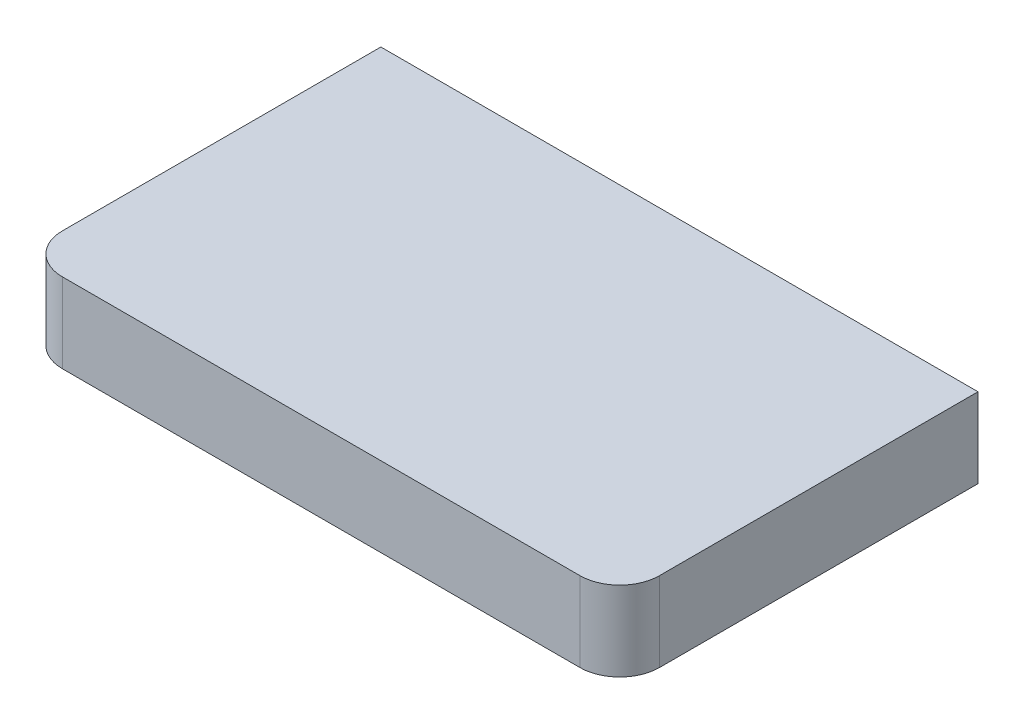
ISO-10303-21;
HEADER;
FILE_DESCRIPTION(('STEP AP214'),'2;1');
FILE_NAME('part.step','',(''),(''),'','','');
FILE_SCHEMA(('AUTOMOTIVE_DESIGN { 1 0 10303 214 1 1 1 1 }'));
ENDSEC;
DATA;
#1=APPLICATION_CONTEXT('core data for automotive mechanical design processes');
#2=APPLICATION_PROTOCOL_DEFINITION('international standard','automotive_design',2000,#1);
#3=PRODUCT_CONTEXT('',#1,'mechanical');
#4=PRODUCT('Part','Part','',(#3));
#5=PRODUCT_RELATED_PRODUCT_CATEGORY('part','',(#4));
#6=PRODUCT_DEFINITION_FORMATION('','',#4);
#7=PRODUCT_DEFINITION_CONTEXT('part definition',#1,'design');
#8=PRODUCT_DEFINITION('design','',#6,#7);
#9=PRODUCT_DEFINITION_SHAPE('','',#8);
#10=(LENGTH_UNIT() NAMED_UNIT(*) SI_UNIT(.MILLI.,.METRE.));
#11=(NAMED_UNIT(*) PLANE_ANGLE_UNIT() SI_UNIT($,.RADIAN.));
#12=(NAMED_UNIT(*) SI_UNIT($,.STERADIAN.) SOLID_ANGLE_UNIT());
#13=UNCERTAINTY_MEASURE_WITH_UNIT(LENGTH_MEASURE(1.E-05),#10,'distance_accuracy_value','');
#14=(GEOMETRIC_REPRESENTATION_CONTEXT(3) GLOBAL_UNCERTAINTY_ASSIGNED_CONTEXT((#13)) GLOBAL_UNIT_ASSIGNED_CONTEXT((#10,
#11,#12)) REPRESENTATION_CONTEXT('',''));
#15=CARTESIAN_POINT('',(0.,0.,0.));
#16=DIRECTION('',(0.,0.,1.));
#17=DIRECTION('',(1.,0.,0.));
#18=AXIS2_PLACEMENT_3D('',#15,#16,#17);
#19=CARTESIAN_POINT('',(-150.,20.,0.));
#20=DIRECTION('',(0.,0.,-1.));
#21=DIRECTION('',(-1.,0.,0.));
#22=AXIS2_PLACEMENT_3D('',#19,#20,#21);
#23=PLANE('',#22);
#24=CARTESIAN_POINT('',(-15.,9.99999999999999,0.));
#25=DIRECTION('',(0.,0.,-1.));
#26=DIRECTION('',(-1.,0.,0.));
#27=AXIS2_PLACEMENT_3D('',#24,#25,#26);
#28=CIRCLE('',#27,5.);
#29=CARTESIAN_POINT('',(-10.,9.99999999999999,0.));
#30=VERTEX_POINT('',#29);
#31=EDGE_CURVE('E143',#30,#30,#28,.F.);
#32=ORIENTED_EDGE('',*,*,#31,.T.);
#33=EDGE_LOOP('',(#32));
#34=FACE_BOUND('',#33,.T.);
#35=CARTESIAN_POINT('',(-75.,9.99999999999999,0.));
#36=DIRECTION('',(0.,0.,-1.));
#37=DIRECTION('',(-1.,0.,0.));
#38=AXIS2_PLACEMENT_3D('',#35,#36,#37);
#39=CIRCLE('',#38,5.);
#40=CARTESIAN_POINT('',(-70.,9.99999999999999,0.));
#41=VERTEX_POINT('',#40);
#42=EDGE_CURVE('E139',#41,#41,#39,.F.);
#43=ORIENTED_EDGE('',*,*,#42,.T.);
#44=EDGE_LOOP('',(#43));
#45=FACE_BOUND('',#44,.T.);
#46=CARTESIAN_POINT('',(-135.,9.99999999999999,0.));
#47=DIRECTION('',(0.,0.,-1.));
#48=DIRECTION('',(-1.,0.,0.));
#49=AXIS2_PLACEMENT_3D('',#46,#47,#48);
#50=CIRCLE('',#49,4.99999999999999);
#51=CARTESIAN_POINT('',(-130.,9.99999999999999,0.));
#52=VERTEX_POINT('',#51);
#53=EDGE_CURVE('E136',#52,#52,#50,.F.);
#54=ORIENTED_EDGE('',*,*,#53,.T.);
#55=EDGE_LOOP('',(#54));
#56=FACE_BOUND('',#55,.T.);
#57=DIRECTION('',(0.,1.,0.));
#58=VECTOR('',#57,1.);
#59=CARTESIAN_POINT('',(0.,20.,0.));
#60=LINE('',#59,#58);
#61=CARTESIAN_POINT('',(0.,0.,0.));
#62=VERTEX_POINT('',#61);
#63=CARTESIAN_POINT('',(0.,20.,0.));
#64=VERTEX_POINT('',#63);
#65=EDGE_CURVE('E120',#62,#64,#60,.T.);
#66=ORIENTED_EDGE('',*,*,#65,.F.);
#67=DIRECTION('',(1.,0.,0.));
#68=VECTOR('',#67,1.);
#69=CARTESIAN_POINT('',(-150.,0.,0.));
#70=LINE('',#69,#68);
#71=CARTESIAN_POINT('',(-150.,0.,0.));
#72=VERTEX_POINT('',#71);
#73=EDGE_CURVE('E111',#72,#62,#70,.T.);
#74=ORIENTED_EDGE('',*,*,#73,.F.);
#75=DIRECTION('',(0.,1.,0.));
#76=VECTOR('',#75,1.);
#77=CARTESIAN_POINT('',(-150.,20.,0.));
#78=LINE('',#77,#76);
#79=CARTESIAN_POINT('',(-150.,20.,0.));
#80=VERTEX_POINT('',#79);
#81=EDGE_CURVE('E107',#72,#80,#78,.T.);
#82=ORIENTED_EDGE('',*,*,#81,.T.);
#83=DIRECTION('',(1.,0.,0.));
#84=VECTOR('',#83,1.);
#85=CARTESIAN_POINT('',(-150.,20.,0.));
#86=LINE('',#85,#84);
#87=EDGE_CURVE('E93',#80,#64,#86,.T.);
#88=ORIENTED_EDGE('',*,*,#87,.T.);
#89=EDGE_LOOP('',(#66,#74,#82,#88));
#90=FACE_BOUND('',#89,.T.);
#91=ADVANCED_FACE('F39',(#34,#45,#56,#90),#23,.T.);
#92=CARTESIAN_POINT('',(-150.,0.,0.));
#93=DIRECTION('',(0.,-1.,0.));
#94=DIRECTION('',(0.,0.,-1.));
#95=AXIS2_PLACEMENT_3D('',#92,#93,#94);
#96=PLANE('',#95);
#97=CARTESIAN_POINT('',(-50.,0.,62.75));
#98=DIRECTION('',(0.,-1.,0.));
#99=DIRECTION('',(0.,0.,-1.));
#100=AXIS2_PLACEMENT_3D('',#97,#98,#99);
#101=CIRCLE('',#100,15.);
#102=CARTESIAN_POINT('',(-50.,0.,77.75));
#103=VERTEX_POINT('',#102);
#104=EDGE_CURVE('E122',#103,#103,#101,.F.);
#105=ORIENTED_EDGE('',*,*,#104,.T.);
#106=EDGE_LOOP('',(#105));
#107=FACE_BOUND('',#106,.T.);
#108=CARTESIAN_POINT('',(-100.,0.,62.75));
#109=DIRECTION('',(0.,-1.,0.));
#110=DIRECTION('',(0.,0.,-1.));
#111=AXIS2_PLACEMENT_3D('',#108,#109,#110);
#112=CIRCLE('',#111,15.);
#113=CARTESIAN_POINT('',(-100.,0.,77.75));
#114=VERTEX_POINT('',#113);
#115=EDGE_CURVE('E130',#114,#114,#112,.F.);
#116=ORIENTED_EDGE('',*,*,#115,.T.);
#117=EDGE_LOOP('',(#116));
#118=FACE_BOUND('',#117,.T.);
#119=DIRECTION('',(1.,0.,0.));
#120=VECTOR('',#119,1.);
#121=CARTESIAN_POINT('',(-150.,0.,90.));
#122=LINE('',#121,#120);
#123=CARTESIAN_POINT('',(-140.,0.,90.));
#124=VERTEX_POINT('',#123);
#125=CARTESIAN_POINT('',(-10.,0.,90.));
#126=VERTEX_POINT('',#125);
#127=EDGE_CURVE('E126',#124,#126,#122,.T.);
#128=ORIENTED_EDGE('',*,*,#127,.F.);
#129=CARTESIAN_POINT('',(-140.,0.,80.));
#130=DIRECTION('',(0.,-1.,0.));
#131=DIRECTION('',(0.,0.,-1.));
#132=AXIS2_PLACEMENT_3D('',#129,#130,#131);
#133=CIRCLE('',#132,10.);
#134=CARTESIAN_POINT('',(-150.,0.,80.));
#135=VERTEX_POINT('',#134);
#136=EDGE_CURVE('E152',#124,#135,#133,.T.);
#137=ORIENTED_EDGE('',*,*,#136,.T.);
#138=DIRECTION('',(0.,0.,-1.));
#139=VECTOR('',#138,1.);
#140=CARTESIAN_POINT('',(-150.,0.,0.));
#141=LINE('',#140,#139);
#142=EDGE_CURVE('E103',#135,#72,#141,.T.);
#143=ORIENTED_EDGE('',*,*,#142,.T.);
#144=ORIENTED_EDGE('',*,*,#73,.T.);
#145=DIRECTION('',(0.,0.,-1.));
#146=VECTOR('',#145,1.);
#147=CARTESIAN_POINT('',(0.,0.,0.));
#148=LINE('',#147,#146);
#149=CARTESIAN_POINT('',(0.,0.,80.));
#150=VERTEX_POINT('',#149);
#151=EDGE_CURVE('E112',#150,#62,#148,.T.);
#152=ORIENTED_EDGE('',*,*,#151,.F.);
#153=CARTESIAN_POINT('',(-10.,0.,80.));
#154=DIRECTION('',(0.,-1.,0.));
#155=DIRECTION('',(0.,0.,-1.));
#156=AXIS2_PLACEMENT_3D('',#153,#154,#155);
#157=CIRCLE('',#156,10.);
#158=EDGE_CURVE('E150',#150,#126,#157,.T.);
#159=ORIENTED_EDGE('',*,*,#158,.T.);
#160=EDGE_LOOP('',(#128,#137,#143,#144,#152,#159));
#161=FACE_BOUND('',#160,.T.);
#162=ADVANCED_FACE('F164',(#107,#118,#161),#96,.T.);
#163=CARTESIAN_POINT('',(-150.,0.,90.));
#164=DIRECTION('',(0.,0.,1.));
#165=DIRECTION('',(0.,-1.,0.));
#166=AXIS2_PLACEMENT_3D('',#163,#164,#165);
#167=PLANE('',#166);
#168=DIRECTION('',(1.,0.,0.));
#169=VECTOR('',#168,1.);
#170=CARTESIAN_POINT('',(-150.,20.,90.));
#171=LINE('',#170,#169);
#172=CARTESIAN_POINT('',(-140.,20.,90.));
#173=VERTEX_POINT('',#172);
#174=CARTESIAN_POINT('',(-10.,20.,90.));
#175=VERTEX_POINT('',#174);
#176=EDGE_CURVE('E102',#173,#175,#171,.T.);
#177=ORIENTED_EDGE('',*,*,#176,.F.);
#178=DIRECTION('',(0.,-1.,0.));
#179=VECTOR('',#178,1.);
#180=CARTESIAN_POINT('',(-140.,0.,90.));
#181=LINE('',#180,#179);
#182=EDGE_CURVE('E147',#173,#124,#181,.T.);
#183=ORIENTED_EDGE('',*,*,#182,.T.);
#184=ORIENTED_EDGE('',*,*,#127,.T.);
#185=DIRECTION('',(0.,-1.,0.));
#186=VECTOR('',#185,1.);
#187=CARTESIAN_POINT('',(-10.,20.,90.));
#188=LINE('',#187,#186);
#189=EDGE_CURVE('E125',#126,#175,#188,.F.);
#190=ORIENTED_EDGE('',*,*,#189,.T.);
#191=EDGE_LOOP('',(#177,#183,#184,#190));
#192=FACE_BOUND('',#191,.T.);
#193=ADVANCED_FACE('F159',(#192),#167,.T.);
#194=CARTESIAN_POINT('',(-150.,20.,90.));
#195=DIRECTION('',(0.,1.,0.));
#196=DIRECTION('',(0.,0.,1.));
#197=AXIS2_PLACEMENT_3D('',#194,#195,#196);
#198=PLANE('',#197);
#199=DIRECTION('',(0.,0.,1.));
#200=VECTOR('',#199,1.);
#201=CARTESIAN_POINT('',(-150.,20.,90.));
#202=LINE('',#201,#200);
#203=CARTESIAN_POINT('',(-150.,20.,80.));
#204=VERTEX_POINT('',#203);
#205=EDGE_CURVE('E95',#80,#204,#202,.T.);
#206=ORIENTED_EDGE('',*,*,#205,.T.);
#207=CARTESIAN_POINT('',(-140.,20.,80.));
#208=DIRECTION('',(0.,1.,0.));
#209=DIRECTION('',(0.,0.,1.));
#210=AXIS2_PLACEMENT_3D('',#207,#208,#209);
#211=CIRCLE('',#210,10.);
#212=EDGE_CURVE('E47',#204,#173,#211,.T.);
#213=ORIENTED_EDGE('',*,*,#212,.T.);
#214=ORIENTED_EDGE('',*,*,#176,.T.);
#215=CARTESIAN_POINT('',(-10.,20.,80.));
#216=DIRECTION('',(0.,1.,0.));
#217=DIRECTION('',(0.,0.,1.));
#218=AXIS2_PLACEMENT_3D('',#215,#216,#217);
#219=CIRCLE('',#218,10.);
#220=CARTESIAN_POINT('',(0.,20.,80.));
#221=VERTEX_POINT('',#220);
#222=EDGE_CURVE('E54',#175,#221,#219,.T.);
#223=ORIENTED_EDGE('',*,*,#222,.T.);
#224=DIRECTION('',(0.,0.,1.));
#225=VECTOR('',#224,1.);
#226=CARTESIAN_POINT('',(0.,20.,90.));
#227=LINE('',#226,#225);
#228=EDGE_CURVE('E97',#64,#221,#227,.T.);
#229=ORIENTED_EDGE('',*,*,#228,.F.);
#230=ORIENTED_EDGE('',*,*,#87,.F.);
#231=EDGE_LOOP('',(#206,#213,#214,#223,#229,#230));
#232=FACE_BOUND('',#231,.T.);
#233=ADVANCED_FACE('F94',(#232),#198,.T.);
#234=CARTESIAN_POINT('',(-150.,0.,0.));
#235=DIRECTION('',(-1.,0.,0.));
#236=DIRECTION('',(0.,0.,1.));
#237=AXIS2_PLACEMENT_3D('',#234,#235,#236);
#238=PLANE('',#237);
#239=ORIENTED_EDGE('',*,*,#142,.F.);
#240=DIRECTION('',(0.,-1.,0.));
#241=VECTOR('',#240,1.);
#242=CARTESIAN_POINT('',(-150.,0.,80.));
#243=LINE('',#242,#241);
#244=EDGE_CURVE('E62',#135,#204,#243,.F.);
#245=ORIENTED_EDGE('',*,*,#244,.T.);
#246=ORIENTED_EDGE('',*,*,#205,.F.);
#247=ORIENTED_EDGE('',*,*,#81,.F.);
#248=EDGE_LOOP('',(#239,#245,#246,#247));
#249=FACE_BOUND('',#248,.T.);
#250=ADVANCED_FACE('F106',(#249),#238,.T.);
#251=CARTESIAN_POINT('',(0.,0.,0.));
#252=DIRECTION('',(-1.,0.,0.));
#253=DIRECTION('',(0.,0.,1.));
#254=AXIS2_PLACEMENT_3D('',#251,#252,#253);
#255=PLANE('',#254);
#256=ORIENTED_EDGE('',*,*,#228,.T.);
#257=DIRECTION('',(0.,-1.,0.));
#258=VECTOR('',#257,1.);
#259=CARTESIAN_POINT('',(0.,0.,80.));
#260=LINE('',#259,#258);
#261=EDGE_CURVE('E11',#221,#150,#260,.T.);
#262=ORIENTED_EDGE('',*,*,#261,.T.);
#263=ORIENTED_EDGE('',*,*,#151,.T.);
#264=ORIENTED_EDGE('',*,*,#65,.T.);
#265=EDGE_LOOP('',(#256,#262,#263,#264));
#266=FACE_BOUND('',#265,.T.);
#267=ADVANCED_FACE('F169',(#266),#255,.F.);
#268=CARTESIAN_POINT('',(-100.,-1.20000000108854E-05,62.75));
#269=DIRECTION('',(0.,1.,0.));
#270=DIRECTION('',(0.,0.,1.));
#271=AXIS2_PLACEMENT_3D('',#268,#269,#270);
#272=CYLINDRICAL_SURFACE('',#271,15.);
#273=CARTESIAN_POINT('',(-100.,9.99999999999999,62.75));
#274=DIRECTION('',(0.,-1.,0.));
#275=DIRECTION('',(0.,0.,-1.));
#276=AXIS2_PLACEMENT_3D('',#273,#274,#275);
#277=CIRCLE('',#276,15.);
#278=CARTESIAN_POINT('',(-100.,9.99999999999999,77.75));
#279=VERTEX_POINT('',#278);
#280=EDGE_CURVE('E116',#279,#279,#277,.T.);
#281=CARTESIAN_POINT('',(-100.,0.,77.75));
#282=CARTESIAN_POINT('',(-100.,0.104166666666657,77.75));
#283=CARTESIAN_POINT('',(-100.,0.208333333333323,77.75));
#284=CARTESIAN_POINT('',(-100.,0.416666666666657,77.75));
#285=CARTESIAN_POINT('',(-100.,0.520833333333323,77.75));
#286=CARTESIAN_POINT('',(-100.,0.729166666666657,77.75));
#287=CARTESIAN_POINT('',(-100.,0.833333333333323,77.75));
#288=CARTESIAN_POINT('',(-100.,1.04166666666666,77.75));
#289=CARTESIAN_POINT('',(-100.,1.14583333333332,77.75));
#290=CARTESIAN_POINT('',(-100.,1.35416666666666,77.75));
#291=CARTESIAN_POINT('',(-100.,1.45833333333332,77.75));
#292=CARTESIAN_POINT('',(-100.,1.66666666666666,77.75));
#293=CARTESIAN_POINT('',(-100.,1.77083333333332,77.75));
#294=CARTESIAN_POINT('',(-100.,1.97916666666666,77.75));
#295=CARTESIAN_POINT('',(-100.,2.08333333333332,77.75));
#296=CARTESIAN_POINT('',(-100.,2.29166666666666,77.75));
#297=CARTESIAN_POINT('',(-100.,2.39583333333332,77.75));
#298=CARTESIAN_POINT('',(-100.,2.60416666666666,77.75));
#299=CARTESIAN_POINT('',(-100.,2.70833333333332,77.75));
#300=CARTESIAN_POINT('',(-100.,2.91666666666666,77.75));
#301=CARTESIAN_POINT('',(-100.,3.02083333333332,77.75));
#302=CARTESIAN_POINT('',(-100.,3.22916666666666,77.75));
#303=CARTESIAN_POINT('',(-100.,3.33333333333332,77.75));
#304=CARTESIAN_POINT('',(-100.,3.54166666666666,77.75));
#305=CARTESIAN_POINT('',(-100.,3.64583333333332,77.75));
#306=CARTESIAN_POINT('',(-100.,3.85416666666666,77.75));
#307=CARTESIAN_POINT('',(-100.,3.95833333333332,77.75));
#308=CARTESIAN_POINT('',(-100.,4.16666666666666,77.75));
#309=CARTESIAN_POINT('',(-100.,4.27083333333332,77.75));
#310=CARTESIAN_POINT('',(-100.,4.47916666666666,77.75));
#311=CARTESIAN_POINT('',(-100.,4.58333333333332,77.75));
#312=CARTESIAN_POINT('',(-100.,4.79166666666666,77.75));
#313=CARTESIAN_POINT('',(-100.,4.89583333333332,77.75));
#314=CARTESIAN_POINT('',(-100.,5.10416666666666,77.75));
#315=CARTESIAN_POINT('',(-100.,5.20833333333332,77.75));
#316=CARTESIAN_POINT('',(-100.,5.41666666666666,77.75));
#317=CARTESIAN_POINT('',(-100.,5.52083333333332,77.75));
#318=CARTESIAN_POINT('',(-100.,5.72916666666666,77.75));
#319=CARTESIAN_POINT('',(-100.,5.83333333333332,77.75));
#320=CARTESIAN_POINT('',(-100.,6.04166666666666,77.75));
#321=CARTESIAN_POINT('',(-100.,6.14583333333332,77.75));
#322=CARTESIAN_POINT('',(-100.,6.35416666666665,77.75));
#323=CARTESIAN_POINT('',(-100.,6.45833333333332,77.75));
#324=CARTESIAN_POINT('',(-100.,6.66666666666665,77.75));
#325=CARTESIAN_POINT('',(-100.,6.77083333333332,77.75));
#326=CARTESIAN_POINT('',(-100.,6.97916666666666,77.75));
#327=CARTESIAN_POINT('',(-100.,7.08333333333332,77.75));
#328=CARTESIAN_POINT('',(-100.,7.29166666666665,77.75));
#329=CARTESIAN_POINT('',(-100.,7.39583333333332,77.75));
#330=CARTESIAN_POINT('',(-100.,7.60416666666665,77.75));
#331=CARTESIAN_POINT('',(-100.,7.70833333333332,77.75));
#332=CARTESIAN_POINT('',(-100.,7.91666666666665,77.75));
#333=CARTESIAN_POINT('',(-100.,8.02083333333332,77.75));
#334=CARTESIAN_POINT('',(-100.,8.22916666666666,77.75));
#335=CARTESIAN_POINT('',(-100.,8.33333333333332,77.75));
#336=CARTESIAN_POINT('',(-100.,8.54166666666666,77.75));
#337=CARTESIAN_POINT('',(-100.,8.64583333333332,77.75));
#338=CARTESIAN_POINT('',(-100.,8.85416666666666,77.75));
#339=CARTESIAN_POINT('',(-100.,8.95833333333332,77.75));
#340=CARTESIAN_POINT('',(-100.,9.16666666666666,77.75));
#341=CARTESIAN_POINT('',(-100.,9.27083333333332,77.75));
#342=CARTESIAN_POINT('',(-100.,9.47916666666666,77.75));
#343=CARTESIAN_POINT('',(-100.,9.58333333333332,77.75));
#344=CARTESIAN_POINT('',(-100.,9.79166666666666,77.75));
#345=CARTESIAN_POINT('',(-100.,9.89583333333332,77.75));
#346=CARTESIAN_POINT('',(-100.,9.99999999999999,77.75));
#347=B_SPLINE_CURVE_WITH_KNOTS('',3,(#281,#282,#283,#284,#285,#286,#287,#288,#289,#290,#291,
#292,#293,#294,#295,#296,#297,#298,#299,#300,#301,#302,#303,#304,#305,#306,#307,#308,#309,#310,
#311,#312,#313,#314,#315,#316,#317,#318,#319,#320,#321,#322,#323,#324,#325,#326,#327,#328,#329,
#330,#331,#332,#333,#334,#335,#336,#337,#338,#339,#340,#341,#342,#343,#344,#345,#346),
.UNSPECIFIED.,.F.,.F.,(4,2,2,2,2,2,2,2,2,2,2,2,2,2,2,2,2,2,2,2,2,2,2,2,2,2,2,2,2,2,2,2,4),(0.,
0.3125,0.625,0.9375,1.25,1.5625,1.875,2.1875,2.5,2.8125,3.125,3.4375,3.75,4.0625,4.375,4.6875,
5.,5.3125,5.625,5.9375,6.25,6.5625,6.875,7.1875,7.5,7.8125,8.125,8.4375,8.75,9.0625,9.375,
9.6875,10.),.UNSPECIFIED.);
#348=EDGE_CURVE('BSEAM171',#114,#279,#347,.T.);
#349=ORIENTED_EDGE('',*,*,#115,.F.);
#350=ORIENTED_EDGE('',*,*,#280,.F.);
#351=ORIENTED_EDGE('',*,*,#348,.T.);
#352=ORIENTED_EDGE('',*,*,#348,.F.);
#353=EDGE_LOOP('',(#349,#351,#350,#352));
#354=FACE_BOUND('',#353,.T.);
#355=ADVANCED_FACE('F171',(#354),#272,.F.);
#356=CARTESIAN_POINT('',(-100.,9.99999999999999,62.75));
#357=DIRECTION('',(0.,-1.,0.));
#358=DIRECTION('',(0.,0.,-1.));
#359=AXIS2_PLACEMENT_3D('',#356,#357,#358);
#360=PLANE('',#359);
#361=ORIENTED_EDGE('',*,*,#280,.T.);
#362=EDGE_LOOP('',(#361));
#363=FACE_BOUND('',#362,.T.);
#364=ADVANCED_FACE('F178',(#363),#360,.T.);
#365=CARTESIAN_POINT('',(-50.,-1.20000000108854E-05,62.75));
#366=DIRECTION('',(0.,1.,0.));
#367=DIRECTION('',(0.,0.,1.));
#368=AXIS2_PLACEMENT_3D('',#365,#366,#367);
#369=CYLINDRICAL_SURFACE('',#368,15.);
#370=CARTESIAN_POINT('',(-50.,9.99999999999999,62.75));
#371=DIRECTION('',(0.,-1.,0.));
#372=DIRECTION('',(0.,0.,-1.));
#373=AXIS2_PLACEMENT_3D('',#370,#371,#372);
#374=CIRCLE('',#373,15.);
#375=CARTESIAN_POINT('',(-50.,9.99999999999999,77.75));
#376=VERTEX_POINT('',#375);
#377=EDGE_CURVE('E133',#376,#376,#374,.T.);
#378=CARTESIAN_POINT('',(-50.,0.,77.75));
#379=CARTESIAN_POINT('',(-50.,0.104166666666657,77.75));
#380=CARTESIAN_POINT('',(-50.,0.208333333333323,77.75));
#381=CARTESIAN_POINT('',(-50.,0.416666666666657,77.75));
#382=CARTESIAN_POINT('',(-50.,0.520833333333323,77.75));
#383=CARTESIAN_POINT('',(-50.,0.729166666666657,77.75));
#384=CARTESIAN_POINT('',(-50.,0.833333333333323,77.75));
#385=CARTESIAN_POINT('',(-50.,1.04166666666666,77.75));
#386=CARTESIAN_POINT('',(-50.,1.14583333333332,77.75));
#387=CARTESIAN_POINT('',(-50.,1.35416666666666,77.75));
#388=CARTESIAN_POINT('',(-50.,1.45833333333332,77.75));
#389=CARTESIAN_POINT('',(-50.,1.66666666666666,77.75));
#390=CARTESIAN_POINT('',(-50.,1.77083333333332,77.75));
#391=CARTESIAN_POINT('',(-50.,1.97916666666666,77.75));
#392=CARTESIAN_POINT('',(-50.,2.08333333333332,77.75));
#393=CARTESIAN_POINT('',(-50.,2.29166666666666,77.75));
#394=CARTESIAN_POINT('',(-50.,2.39583333333332,77.75));
#395=CARTESIAN_POINT('',(-50.,2.60416666666666,77.75));
#396=CARTESIAN_POINT('',(-50.,2.70833333333332,77.75));
#397=CARTESIAN_POINT('',(-50.,2.91666666666666,77.75));
#398=CARTESIAN_POINT('',(-50.,3.02083333333332,77.75));
#399=CARTESIAN_POINT('',(-50.,3.22916666666666,77.75));
#400=CARTESIAN_POINT('',(-50.,3.33333333333332,77.75));
#401=CARTESIAN_POINT('',(-50.,3.54166666666666,77.75));
#402=CARTESIAN_POINT('',(-50.,3.64583333333332,77.75));
#403=CARTESIAN_POINT('',(-50.,3.85416666666666,77.75));
#404=CARTESIAN_POINT('',(-50.,3.95833333333332,77.75));
#405=CARTESIAN_POINT('',(-50.,4.16666666666666,77.75));
#406=CARTESIAN_POINT('',(-50.,4.27083333333332,77.75));
#407=CARTESIAN_POINT('',(-50.,4.47916666666666,77.75));
#408=CARTESIAN_POINT('',(-50.,4.58333333333332,77.75));
#409=CARTESIAN_POINT('',(-50.,4.79166666666666,77.75));
#410=CARTESIAN_POINT('',(-50.,4.89583333333332,77.75));
#411=CARTESIAN_POINT('',(-50.,5.10416666666666,77.75));
#412=CARTESIAN_POINT('',(-50.,5.20833333333332,77.75));
#413=CARTESIAN_POINT('',(-50.,5.41666666666666,77.75));
#414=CARTESIAN_POINT('',(-50.,5.52083333333332,77.75));
#415=CARTESIAN_POINT('',(-50.,5.72916666666666,77.75));
#416=CARTESIAN_POINT('',(-50.,5.83333333333332,77.75));
#417=CARTESIAN_POINT('',(-50.,6.04166666666666,77.75));
#418=CARTESIAN_POINT('',(-50.,6.14583333333332,77.75));
#419=CARTESIAN_POINT('',(-50.,6.35416666666665,77.75));
#420=CARTESIAN_POINT('',(-50.,6.45833333333332,77.75));
#421=CARTESIAN_POINT('',(-50.,6.66666666666665,77.75));
#422=CARTESIAN_POINT('',(-50.,6.77083333333332,77.75));
#423=CARTESIAN_POINT('',(-50.,6.97916666666666,77.75));
#424=CARTESIAN_POINT('',(-50.,7.08333333333332,77.75));
#425=CARTESIAN_POINT('',(-50.,7.29166666666665,77.75));
#426=CARTESIAN_POINT('',(-50.,7.39583333333332,77.75));
#427=CARTESIAN_POINT('',(-50.,7.60416666666665,77.75));
#428=CARTESIAN_POINT('',(-50.,7.70833333333332,77.75));
#429=CARTESIAN_POINT('',(-50.,7.91666666666665,77.75));
#430=CARTESIAN_POINT('',(-50.,8.02083333333332,77.75));
#431=CARTESIAN_POINT('',(-50.,8.22916666666666,77.75));
#432=CARTESIAN_POINT('',(-50.,8.33333333333332,77.75));
#433=CARTESIAN_POINT('',(-50.,8.54166666666666,77.75));
#434=CARTESIAN_POINT('',(-50.,8.64583333333332,77.75));
#435=CARTESIAN_POINT('',(-50.,8.85416666666666,77.75));
#436=CARTESIAN_POINT('',(-50.,8.95833333333332,77.75));
#437=CARTESIAN_POINT('',(-50.,9.16666666666666,77.75));
#438=CARTESIAN_POINT('',(-50.,9.27083333333332,77.75));
#439=CARTESIAN_POINT('',(-50.,9.47916666666666,77.75));
#440=CARTESIAN_POINT('',(-50.,9.58333333333332,77.75));
#441=CARTESIAN_POINT('',(-50.,9.79166666666666,77.75));
#442=CARTESIAN_POINT('',(-50.,9.89583333333332,77.75));
#443=CARTESIAN_POINT('',(-50.,9.99999999999999,77.75));
#444=B_SPLINE_CURVE_WITH_KNOTS('',3,(#378,#379,#380,#381,#382,#383,#384,#385,#386,#387,#388,
#389,#390,#391,#392,#393,#394,#395,#396,#397,#398,#399,#400,#401,#402,#403,#404,#405,#406,#407,
#408,#409,#410,#411,#412,#413,#414,#415,#416,#417,#418,#419,#420,#421,#422,#423,#424,#425,#426,
#427,#428,#429,#430,#431,#432,#433,#434,#435,#436,#437,#438,#439,#440,#441,#442,#443),
.UNSPECIFIED.,.F.,.F.,(4,2,2,2,2,2,2,2,2,2,2,2,2,2,2,2,2,2,2,2,2,2,2,2,2,2,2,2,2,2,2,2,4),(0.,
0.3125,0.625,0.9375,1.25,1.5625,1.875,2.1875,2.5,2.8125,3.125,3.4375,3.75,4.0625,4.375,4.6875,
5.,5.3125,5.625,5.9375,6.25,6.5625,6.875,7.1875,7.5,7.8125,8.125,8.4375,8.75,9.0625,9.375,
9.6875,10.),.UNSPECIFIED.);
#445=EDGE_CURVE('BSEAM227',#103,#376,#444,.T.);
#446=ORIENTED_EDGE('',*,*,#104,.F.);
#447=ORIENTED_EDGE('',*,*,#377,.F.);
#448=ORIENTED_EDGE('',*,*,#445,.T.);
#449=ORIENTED_EDGE('',*,*,#445,.F.);
#450=EDGE_LOOP('',(#446,#448,#447,#449));
#451=FACE_BOUND('',#450,.T.);
#452=ADVANCED_FACE('F227',(#451),#369,.F.);
#453=CARTESIAN_POINT('',(-50.,9.99999999999999,62.75));
#454=DIRECTION('',(0.,-1.,0.));
#455=DIRECTION('',(0.,0.,-1.));
#456=AXIS2_PLACEMENT_3D('',#453,#454,#455);
#457=PLANE('',#456);
#458=ORIENTED_EDGE('',*,*,#377,.T.);
#459=EDGE_LOOP('',(#458));
#460=FACE_BOUND('',#459,.T.);
#461=ADVANCED_FACE('F221',(#460),#457,.T.);
#462=CARTESIAN_POINT('',(-135.,9.99999999999999,-1.2E-05));
#463=DIRECTION('',(0.,0.,1.));
#464=DIRECTION('',(1.,0.,0.));
#465=AXIS2_PLACEMENT_3D('',#462,#463,#464);
#466=CYLINDRICAL_SURFACE('',#465,4.99999999999999);
#467=CARTESIAN_POINT('',(-135.,9.99999999999999,70.));
#468=DIRECTION('',(0.,0.,-1.));
#469=DIRECTION('',(-1.,0.,0.));
#470=AXIS2_PLACEMENT_3D('',#467,#468,#469);
#471=CIRCLE('',#470,4.99999999999999);
#472=CARTESIAN_POINT('',(-130.,9.99999999999999,70.));
#473=VERTEX_POINT('',#472);
#474=EDGE_CURVE('E242',#473,#473,#471,.T.);
#475=CARTESIAN_POINT('',(-130.,9.99999999999999,0.));
#476=CARTESIAN_POINT('',(-130.,9.99999999999999,0.729166666666666));
#477=CARTESIAN_POINT('',(-130.,9.99999999999999,1.45833333333333));
#478=CARTESIAN_POINT('',(-130.,9.99999999999999,2.91666666666667));
#479=CARTESIAN_POINT('',(-130.,9.99999999999999,3.64583333333333));
#480=CARTESIAN_POINT('',(-130.,9.99999999999999,5.10416666666667));
#481=CARTESIAN_POINT('',(-130.,9.99999999999999,5.83333333333334));
#482=CARTESIAN_POINT('',(-130.,9.99999999999999,7.29166666666667));
#483=CARTESIAN_POINT('',(-130.,9.99999999999999,8.02083333333334));
#484=CARTESIAN_POINT('',(-130.,9.99999999999999,9.47916666666667));
#485=CARTESIAN_POINT('',(-130.,9.99999999999999,10.2083333333333));
#486=CARTESIAN_POINT('',(-130.,9.99999999999999,11.6666666666667));
#487=CARTESIAN_POINT('',(-130.,9.99999999999999,12.3958333333333));
#488=CARTESIAN_POINT('',(-130.,9.99999999999999,13.8541666666667));
#489=CARTESIAN_POINT('',(-130.,9.99999999999999,14.5833333333333));
#490=CARTESIAN_POINT('',(-130.,9.99999999999999,16.0416666666667));
#491=CARTESIAN_POINT('',(-130.,9.99999999999999,16.7708333333333));
#492=CARTESIAN_POINT('',(-130.,9.99999999999999,18.2291666666667));
#493=CARTESIAN_POINT('',(-130.,9.99999999999999,18.9583333333333));
#494=CARTESIAN_POINT('',(-130.,9.99999999999999,20.4166666666667));
#495=CARTESIAN_POINT('',(-130.,9.99999999999999,21.1458333333333));
#496=CARTESIAN_POINT('',(-130.,9.99999999999999,22.6041666666667));
#497=CARTESIAN_POINT('',(-130.,9.99999999999999,23.3333333333333));
#498=CARTESIAN_POINT('',(-130.,9.99999999999999,24.7916666666667));
#499=CARTESIAN_POINT('',(-130.,9.99999999999999,25.5208333333333));
#500=CARTESIAN_POINT('',(-130.,9.99999999999999,26.9791666666667));
#501=CARTESIAN_POINT('',(-130.,9.99999999999999,27.7083333333333));
#502=CARTESIAN_POINT('',(-130.,9.99999999999999,29.1666666666667));
#503=CARTESIAN_POINT('',(-130.,9.99999999999999,29.8958333333333));
#504=CARTESIAN_POINT('',(-130.,9.99999999999999,31.3541666666667));
#505=CARTESIAN_POINT('',(-130.,9.99999999999999,32.0833333333333));
#506=CARTESIAN_POINT('',(-130.,9.99999999999999,33.5416666666667));
#507=CARTESIAN_POINT('',(-130.,9.99999999999999,34.2708333333333));
#508=CARTESIAN_POINT('',(-130.,9.99999999999999,35.7291666666667));
#509=CARTESIAN_POINT('',(-130.,9.99999999999999,36.4583333333333));
#510=CARTESIAN_POINT('',(-130.,9.99999999999999,37.9166666666667));
#511=CARTESIAN_POINT('',(-130.,9.99999999999999,38.6458333333333));
#512=CARTESIAN_POINT('',(-130.,9.99999999999999,40.1041666666667));
#513=CARTESIAN_POINT('',(-130.,9.99999999999999,40.8333333333333));
#514=CARTESIAN_POINT('',(-130.,9.99999999999999,42.2916666666667));
#515=CARTESIAN_POINT('',(-130.,9.99999999999999,43.0208333333333));
#516=CARTESIAN_POINT('',(-130.,9.99999999999999,44.4791666666667));
#517=CARTESIAN_POINT('',(-130.,9.99999999999999,45.2083333333333));
#518=CARTESIAN_POINT('',(-130.,9.99999999999999,46.6666666666667));
#519=CARTESIAN_POINT('',(-130.,9.99999999999999,47.3958333333333));
#520=CARTESIAN_POINT('',(-130.,9.99999999999999,48.8541666666667));
#521=CARTESIAN_POINT('',(-130.,9.99999999999999,49.5833333333333));
#522=CARTESIAN_POINT('',(-130.,9.99999999999999,51.0416666666667));
#523=CARTESIAN_POINT('',(-130.,9.99999999999999,51.7708333333333));
#524=CARTESIAN_POINT('',(-130.,9.99999999999999,53.2291666666667));
#525=CARTESIAN_POINT('',(-130.,9.99999999999999,53.9583333333333));
#526=CARTESIAN_POINT('',(-130.,9.99999999999999,55.4166666666667));
#527=CARTESIAN_POINT('',(-130.,9.99999999999999,56.1458333333333));
#528=CARTESIAN_POINT('',(-130.,9.99999999999999,57.6041666666667));
#529=CARTESIAN_POINT('',(-130.,9.99999999999999,58.3333333333334));
#530=CARTESIAN_POINT('',(-130.,9.99999999999999,59.7916666666667));
#531=CARTESIAN_POINT('',(-130.,9.99999999999999,60.5208333333334));
#532=CARTESIAN_POINT('',(-130.,9.99999999999999,61.9791666666667));
#533=CARTESIAN_POINT('',(-130.,9.99999999999999,62.7083333333333));
#534=CARTESIAN_POINT('',(-130.,9.99999999999999,64.1666666666667));
#535=CARTESIAN_POINT('',(-130.,9.99999999999999,64.8958333333333));
#536=CARTESIAN_POINT('',(-130.,9.99999999999999,66.3541666666667));
#537=CARTESIAN_POINT('',(-130.,9.99999999999999,67.0833333333334));
#538=CARTESIAN_POINT('',(-130.,9.99999999999999,68.5416666666667));
#539=CARTESIAN_POINT('',(-130.,9.99999999999999,69.2708333333334));
#540=CARTESIAN_POINT('',(-130.,9.99999999999999,70.));
#541=B_SPLINE_CURVE_WITH_KNOTS('',3,(#475,#476,#477,#478,#479,#480,#481,#482,#483,#484,#485,
#486,#487,#488,#489,#490,#491,#492,#493,#494,#495,#496,#497,#498,#499,#500,#501,#502,#503,#504,
#505,#506,#507,#508,#509,#510,#511,#512,#513,#514,#515,#516,#517,#518,#519,#520,#521,#522,#523,
#524,#525,#526,#527,#528,#529,#530,#531,#532,#533,#534,#535,#536,#537,#538,#539,#540),
.UNSPECIFIED.,.F.,.F.,(4,2,2,2,2,2,2,2,2,2,2,2,2,2,2,2,2,2,2,2,2,2,2,2,2,2,2,2,2,2,2,2,4),(0.,
2.1875,4.375,6.5625,8.75,10.9375,13.125,15.3125,17.5,19.6875,21.875,24.0625,26.25,28.4375,
30.625,32.8125,35.,37.1875,39.375,41.5625,43.75,45.9375,48.125,50.3125,52.5,54.6875,56.875,
59.0625,61.25,63.4375,65.625,67.8125,70.),.UNSPECIFIED.);
#542=EDGE_CURVE('BSEAM219',#52,#473,#541,.T.);
#543=ORIENTED_EDGE('',*,*,#53,.F.);
#544=ORIENTED_EDGE('',*,*,#474,.F.);
#545=ORIENTED_EDGE('',*,*,#542,.T.);
#546=ORIENTED_EDGE('',*,*,#542,.F.);
#547=EDGE_LOOP('',(#543,#545,#544,#546));
#548=FACE_BOUND('',#547,.T.);
#549=ADVANCED_FACE('F219',(#548),#466,.F.);
#550=CARTESIAN_POINT('',(-135.,9.99999999999999,70.));
#551=DIRECTION('',(0.,0.,-1.));
#552=DIRECTION('',(-1.,0.,0.));
#553=AXIS2_PLACEMENT_3D('',#550,#551,#552);
#554=PLANE('',#553);
#555=ORIENTED_EDGE('',*,*,#474,.T.);
#556=EDGE_LOOP('',(#555));
#557=FACE_BOUND('',#556,.T.);
#558=ADVANCED_FACE('F214',(#557),#554,.T.);
#559=CARTESIAN_POINT('',(-75.,9.99999999999999,-1.2E-05));
#560=DIRECTION('',(0.,0.,1.));
#561=DIRECTION('',(1.,0.,0.));
#562=AXIS2_PLACEMENT_3D('',#559,#560,#561);
#563=CYLINDRICAL_SURFACE('',#562,5.);
#564=CARTESIAN_POINT('',(-75.,9.99999999999999,70.));
#565=DIRECTION('',(0.,0.,-1.));
#566=DIRECTION('',(-1.,0.,0.));
#567=AXIS2_PLACEMENT_3D('',#564,#565,#566);
#568=CIRCLE('',#567,5.);
#569=CARTESIAN_POINT('',(-70.,9.99999999999999,70.));
#570=VERTEX_POINT('',#569);
#571=EDGE_CURVE('E245',#570,#570,#568,.T.);
#572=CARTESIAN_POINT('',(-70.,9.99999999999999,0.));
#573=CARTESIAN_POINT('',(-70.,9.99999999999999,0.729166666666666));
#574=CARTESIAN_POINT('',(-70.,9.99999999999999,1.45833333333333));
#575=CARTESIAN_POINT('',(-70.,9.99999999999999,2.91666666666667));
#576=CARTESIAN_POINT('',(-70.,9.99999999999999,3.64583333333333));
#577=CARTESIAN_POINT('',(-70.,9.99999999999999,5.10416666666667));
#578=CARTESIAN_POINT('',(-70.,9.99999999999999,5.83333333333334));
#579=CARTESIAN_POINT('',(-70.,9.99999999999999,7.29166666666667));
#580=CARTESIAN_POINT('',(-70.,9.99999999999999,8.02083333333334));
#581=CARTESIAN_POINT('',(-70.,9.99999999999999,9.47916666666667));
#582=CARTESIAN_POINT('',(-70.,9.99999999999999,10.2083333333333));
#583=CARTESIAN_POINT('',(-70.,9.99999999999999,11.6666666666667));
#584=CARTESIAN_POINT('',(-70.,9.99999999999999,12.3958333333333));
#585=CARTESIAN_POINT('',(-70.,9.99999999999999,13.8541666666667));
#586=CARTESIAN_POINT('',(-70.,9.99999999999999,14.5833333333333));
#587=CARTESIAN_POINT('',(-70.,9.99999999999999,16.0416666666667));
#588=CARTESIAN_POINT('',(-70.,9.99999999999999,16.7708333333333));
#589=CARTESIAN_POINT('',(-70.,9.99999999999999,18.2291666666667));
#590=CARTESIAN_POINT('',(-70.,9.99999999999999,18.9583333333333));
#591=CARTESIAN_POINT('',(-70.,9.99999999999999,20.4166666666667));
#592=CARTESIAN_POINT('',(-70.,9.99999999999999,21.1458333333333));
#593=CARTESIAN_POINT('',(-70.,9.99999999999999,22.6041666666667));
#594=CARTESIAN_POINT('',(-70.,9.99999999999999,23.3333333333333));
#595=CARTESIAN_POINT('',(-70.,9.99999999999999,24.7916666666667));
#596=CARTESIAN_POINT('',(-70.,9.99999999999999,25.5208333333333));
#597=CARTESIAN_POINT('',(-70.,9.99999999999999,26.9791666666667));
#598=CARTESIAN_POINT('',(-70.,9.99999999999999,27.7083333333333));
#599=CARTESIAN_POINT('',(-70.,9.99999999999999,29.1666666666667));
#600=CARTESIAN_POINT('',(-70.,9.99999999999999,29.8958333333333));
#601=CARTESIAN_POINT('',(-70.,9.99999999999999,31.3541666666667));
#602=CARTESIAN_POINT('',(-70.,9.99999999999999,32.0833333333333));
#603=CARTESIAN_POINT('',(-70.,9.99999999999999,33.5416666666667));
#604=CARTESIAN_POINT('',(-70.,9.99999999999999,34.2708333333333));
#605=CARTESIAN_POINT('',(-70.,9.99999999999999,35.7291666666667));
#606=CARTESIAN_POINT('',(-70.,9.99999999999999,36.4583333333333));
#607=CARTESIAN_POINT('',(-70.,9.99999999999999,37.9166666666667));
#608=CARTESIAN_POINT('',(-70.,9.99999999999999,38.6458333333333));
#609=CARTESIAN_POINT('',(-70.,9.99999999999999,40.1041666666667));
#610=CARTESIAN_POINT('',(-70.,9.99999999999999,40.8333333333333));
#611=CARTESIAN_POINT('',(-70.,9.99999999999999,42.2916666666667));
#612=CARTESIAN_POINT('',(-70.,9.99999999999999,43.0208333333333));
#613=CARTESIAN_POINT('',(-70.,9.99999999999999,44.4791666666667));
#614=CARTESIAN_POINT('',(-70.,9.99999999999999,45.2083333333333));
#615=CARTESIAN_POINT('',(-70.,9.99999999999999,46.6666666666667));
#616=CARTESIAN_POINT('',(-70.,9.99999999999999,47.3958333333333));
#617=CARTESIAN_POINT('',(-70.,9.99999999999999,48.8541666666667));
#618=CARTESIAN_POINT('',(-70.,9.99999999999999,49.5833333333333));
#619=CARTESIAN_POINT('',(-70.,9.99999999999999,51.0416666666667));
#620=CARTESIAN_POINT('',(-70.,9.99999999999999,51.7708333333333));
#621=CARTESIAN_POINT('',(-70.,9.99999999999999,53.2291666666667));
#622=CARTESIAN_POINT('',(-70.,9.99999999999999,53.9583333333333));
#623=CARTESIAN_POINT('',(-70.,9.99999999999999,55.4166666666667));
#624=CARTESIAN_POINT('',(-70.,9.99999999999999,56.1458333333333));
#625=CARTESIAN_POINT('',(-70.,9.99999999999999,57.6041666666667));
#626=CARTESIAN_POINT('',(-70.,9.99999999999999,58.3333333333334));
#627=CARTESIAN_POINT('',(-70.,9.99999999999999,59.7916666666667));
#628=CARTESIAN_POINT('',(-70.,9.99999999999999,60.5208333333334));
#629=CARTESIAN_POINT('',(-70.,9.99999999999999,61.9791666666667));
#630=CARTESIAN_POINT('',(-70.,9.99999999999999,62.7083333333333));
#631=CARTESIAN_POINT('',(-70.,9.99999999999999,64.1666666666667));
#632=CARTESIAN_POINT('',(-70.,9.99999999999999,64.8958333333333));
#633=CARTESIAN_POINT('',(-70.,9.99999999999999,66.3541666666667));
#634=CARTESIAN_POINT('',(-70.,9.99999999999999,67.0833333333334));
#635=CARTESIAN_POINT('',(-70.,9.99999999999999,68.5416666666667));
#636=CARTESIAN_POINT('',(-70.,9.99999999999999,69.2708333333334));
#637=CARTESIAN_POINT('',(-70.,9.99999999999999,70.));
#638=B_SPLINE_CURVE_WITH_KNOTS('',3,(#572,#573,#574,#575,#576,#577,#578,#579,#580,#581,#582,
#583,#584,#585,#586,#587,#588,#589,#590,#591,#592,#593,#594,#595,#596,#597,#598,#599,#600,#601,
#602,#603,#604,#605,#606,#607,#608,#609,#610,#611,#612,#613,#614,#615,#616,#617,#618,#619,#620,
#621,#622,#623,#624,#625,#626,#627,#628,#629,#630,#631,#632,#633,#634,#635,#636,#637),
.UNSPECIFIED.,.F.,.F.,(4,2,2,2,2,2,2,2,2,2,2,2,2,2,2,2,2,2,2,2,2,2,2,2,2,2,2,2,2,2,2,2,4),(0.,
2.1875,4.375,6.5625,8.75,10.9375,13.125,15.3125,17.5,19.6875,21.875,24.0625,26.25,28.4375,
30.625,32.8125,35.,37.1875,39.375,41.5625,43.75,45.9375,48.125,50.3125,52.5,54.6875,56.875,
59.0625,61.25,63.4375,65.625,67.8125,70.),.UNSPECIFIED.);
#639=EDGE_CURVE('BSEAM211',#41,#570,#638,.T.);
#640=ORIENTED_EDGE('',*,*,#42,.F.);
#641=ORIENTED_EDGE('',*,*,#571,.F.);
#642=ORIENTED_EDGE('',*,*,#639,.T.);
#643=ORIENTED_EDGE('',*,*,#639,.F.);
#644=EDGE_LOOP('',(#640,#642,#641,#643));
#645=FACE_BOUND('',#644,.T.);
#646=ADVANCED_FACE('F211',(#645),#563,.F.);
#647=CARTESIAN_POINT('',(-75.,9.99999999999999,70.));
#648=DIRECTION('',(0.,0.,-1.));
#649=DIRECTION('',(-1.,0.,0.));
#650=AXIS2_PLACEMENT_3D('',#647,#648,#649);
#651=PLANE('',#650);
#652=ORIENTED_EDGE('',*,*,#571,.T.);
#653=EDGE_LOOP('',(#652));
#654=FACE_BOUND('',#653,.T.);
#655=ADVANCED_FACE('F206',(#654),#651,.T.);
#656=CARTESIAN_POINT('',(-15.,9.99999999999999,-1.2E-05));
#657=DIRECTION('',(0.,0.,1.));
#658=DIRECTION('',(1.,0.,0.));
#659=AXIS2_PLACEMENT_3D('',#656,#657,#658);
#660=CYLINDRICAL_SURFACE('',#659,5.);
#661=CARTESIAN_POINT('',(-15.,9.99999999999999,70.));
#662=DIRECTION('',(0.,0.,-1.));
#663=DIRECTION('',(-1.,0.,0.));
#664=AXIS2_PLACEMENT_3D('',#661,#662,#663);
#665=CIRCLE('',#664,5.);
#666=CARTESIAN_POINT('',(-10.,9.99999999999999,70.));
#667=VERTEX_POINT('',#666);
#668=EDGE_CURVE('E140',#667,#667,#665,.T.);
#669=CARTESIAN_POINT('',(-10.,9.99999999999999,0.));
#670=CARTESIAN_POINT('',(-10.,9.99999999999999,0.729166666666666));
#671=CARTESIAN_POINT('',(-10.,9.99999999999999,1.45833333333333));
#672=CARTESIAN_POINT('',(-10.,9.99999999999999,2.91666666666667));
#673=CARTESIAN_POINT('',(-10.,9.99999999999999,3.64583333333333));
#674=CARTESIAN_POINT('',(-10.,9.99999999999999,5.10416666666667));
#675=CARTESIAN_POINT('',(-10.,9.99999999999999,5.83333333333334));
#676=CARTESIAN_POINT('',(-10.,9.99999999999999,7.29166666666667));
#677=CARTESIAN_POINT('',(-10.,9.99999999999999,8.02083333333334));
#678=CARTESIAN_POINT('',(-10.,9.99999999999999,9.47916666666667));
#679=CARTESIAN_POINT('',(-10.,9.99999999999999,10.2083333333333));
#680=CARTESIAN_POINT('',(-10.,9.99999999999999,11.6666666666667));
#681=CARTESIAN_POINT('',(-10.,9.99999999999999,12.3958333333333));
#682=CARTESIAN_POINT('',(-10.,9.99999999999999,13.8541666666667));
#683=CARTESIAN_POINT('',(-10.,9.99999999999999,14.5833333333333));
#684=CARTESIAN_POINT('',(-10.,9.99999999999999,16.0416666666667));
#685=CARTESIAN_POINT('',(-10.,9.99999999999999,16.7708333333333));
#686=CARTESIAN_POINT('',(-10.,9.99999999999999,18.2291666666667));
#687=CARTESIAN_POINT('',(-10.,9.99999999999999,18.9583333333333));
#688=CARTESIAN_POINT('',(-10.,9.99999999999999,20.4166666666667));
#689=CARTESIAN_POINT('',(-10.,9.99999999999999,21.1458333333333));
#690=CARTESIAN_POINT('',(-10.,9.99999999999999,22.6041666666667));
#691=CARTESIAN_POINT('',(-10.,9.99999999999999,23.3333333333333));
#692=CARTESIAN_POINT('',(-10.,9.99999999999999,24.7916666666667));
#693=CARTESIAN_POINT('',(-10.,9.99999999999999,25.5208333333333));
#694=CARTESIAN_POINT('',(-10.,9.99999999999999,26.9791666666667));
#695=CARTESIAN_POINT('',(-10.,9.99999999999999,27.7083333333333));
#696=CARTESIAN_POINT('',(-10.,9.99999999999999,29.1666666666667));
#697=CARTESIAN_POINT('',(-10.,9.99999999999999,29.8958333333333));
#698=CARTESIAN_POINT('',(-10.,9.99999999999999,31.3541666666667));
#699=CARTESIAN_POINT('',(-10.,9.99999999999999,32.0833333333333));
#700=CARTESIAN_POINT('',(-10.,9.99999999999999,33.5416666666667));
#701=CARTESIAN_POINT('',(-10.,9.99999999999999,34.2708333333333));
#702=CARTESIAN_POINT('',(-10.,9.99999999999999,35.7291666666667));
#703=CARTESIAN_POINT('',(-10.,9.99999999999999,36.4583333333333));
#704=CARTESIAN_POINT('',(-10.,9.99999999999999,37.9166666666667));
#705=CARTESIAN_POINT('',(-10.,9.99999999999999,38.6458333333333));
#706=CARTESIAN_POINT('',(-10.,9.99999999999999,40.1041666666667));
#707=CARTESIAN_POINT('',(-10.,9.99999999999999,40.8333333333333));
#708=CARTESIAN_POINT('',(-10.,9.99999999999999,42.2916666666667));
#709=CARTESIAN_POINT('',(-10.,9.99999999999999,43.0208333333333));
#710=CARTESIAN_POINT('',(-10.,9.99999999999999,44.4791666666667));
#711=CARTESIAN_POINT('',(-10.,9.99999999999999,45.2083333333333));
#712=CARTESIAN_POINT('',(-10.,9.99999999999999,46.6666666666667));
#713=CARTESIAN_POINT('',(-10.,9.99999999999999,47.3958333333333));
#714=CARTESIAN_POINT('',(-10.,9.99999999999999,48.8541666666667));
#715=CARTESIAN_POINT('',(-10.,9.99999999999999,49.5833333333333));
#716=CARTESIAN_POINT('',(-10.,9.99999999999999,51.0416666666667));
#717=CARTESIAN_POINT('',(-10.,9.99999999999999,51.7708333333333));
#718=CARTESIAN_POINT('',(-10.,9.99999999999999,53.2291666666667));
#719=CARTESIAN_POINT('',(-10.,9.99999999999999,53.9583333333333));
#720=CARTESIAN_POINT('',(-10.,9.99999999999999,55.4166666666667));
#721=CARTESIAN_POINT('',(-10.,9.99999999999999,56.1458333333333));
#722=CARTESIAN_POINT('',(-10.,9.99999999999999,57.6041666666667));
#723=CARTESIAN_POINT('',(-10.,9.99999999999999,58.3333333333334));
#724=CARTESIAN_POINT('',(-10.,9.99999999999999,59.7916666666667));
#725=CARTESIAN_POINT('',(-10.,9.99999999999999,60.5208333333334));
#726=CARTESIAN_POINT('',(-10.,9.99999999999999,61.9791666666667));
#727=CARTESIAN_POINT('',(-10.,9.99999999999999,62.7083333333333));
#728=CARTESIAN_POINT('',(-10.,9.99999999999999,64.1666666666667));
#729=CARTESIAN_POINT('',(-10.,9.99999999999999,64.8958333333333));
#730=CARTESIAN_POINT('',(-10.,9.99999999999999,66.3541666666667));
#731=CARTESIAN_POINT('',(-10.,9.99999999999999,67.0833333333334));
#732=CARTESIAN_POINT('',(-10.,9.99999999999999,68.5416666666667));
#733=CARTESIAN_POINT('',(-10.,9.99999999999999,69.2708333333334));
#734=CARTESIAN_POINT('',(-10.,9.99999999999999,70.));
#735=B_SPLINE_CURVE_WITH_KNOTS('',3,(#669,#670,#671,#672,#673,#674,#675,#676,#677,#678,#679,
#680,#681,#682,#683,#684,#685,#686,#687,#688,#689,#690,#691,#692,#693,#694,#695,#696,#697,#698,
#699,#700,#701,#702,#703,#704,#705,#706,#707,#708,#709,#710,#711,#712,#713,#714,#715,#716,#717,
#718,#719,#720,#721,#722,#723,#724,#725,#726,#727,#728,#729,#730,#731,#732,#733,#734),
.UNSPECIFIED.,.F.,.F.,(4,2,2,2,2,2,2,2,2,2,2,2,2,2,2,2,2,2,2,2,2,2,2,2,2,2,2,2,2,2,2,2,4),(0.,
2.1875,4.375,6.5625,8.75,10.9375,13.125,15.3125,17.5,19.6875,21.875,24.0625,26.25,28.4375,
30.625,32.8125,35.,37.1875,39.375,41.5625,43.75,45.9375,48.125,50.3125,52.5,54.6875,56.875,
59.0625,61.25,63.4375,65.625,67.8125,70.),.UNSPECIFIED.);
#736=EDGE_CURVE('BSEAM200',#30,#667,#735,.T.);
#737=ORIENTED_EDGE('',*,*,#31,.F.);
#738=ORIENTED_EDGE('',*,*,#668,.F.);
#739=ORIENTED_EDGE('',*,*,#736,.T.);
#740=ORIENTED_EDGE('',*,*,#736,.F.);
#741=EDGE_LOOP('',(#737,#739,#738,#740));
#742=FACE_BOUND('',#741,.T.);
#743=ADVANCED_FACE('F200',(#742),#660,.F.);
#744=CARTESIAN_POINT('',(-15.,9.99999999999999,70.));
#745=DIRECTION('',(0.,0.,-1.));
#746=DIRECTION('',(-1.,0.,0.));
#747=AXIS2_PLACEMENT_3D('',#744,#745,#746);
#748=PLANE('',#747);
#749=ORIENTED_EDGE('',*,*,#668,.T.);
#750=EDGE_LOOP('',(#749));
#751=FACE_BOUND('',#750,.T.);
#752=ADVANCED_FACE('F195',(#751),#748,.T.);
#753=CARTESIAN_POINT('',(-140.,0.,80.));
#754=DIRECTION('',(0.,-1.,0.));
#755=DIRECTION('',(0.,0.,-1.));
#756=AXIS2_PLACEMENT_3D('',#753,#754,#755);
#757=CYLINDRICAL_SURFACE('',#756,10.);
#758=ORIENTED_EDGE('',*,*,#212,.F.);
#759=ORIENTED_EDGE('',*,*,#244,.F.);
#760=ORIENTED_EDGE('',*,*,#136,.F.);
#761=ORIENTED_EDGE('',*,*,#182,.F.);
#762=EDGE_LOOP('',(#758,#759,#760,#761));
#763=FACE_BOUND('',#762,.T.);
#764=ADVANCED_FACE('F162',(#763),#757,.T.);
#765=CARTESIAN_POINT('',(-10.,0.,80.));
#766=DIRECTION('',(0.,1.,0.));
#767=DIRECTION('',(0.,0.,1.));
#768=AXIS2_PLACEMENT_3D('',#765,#766,#767);
#769=CYLINDRICAL_SURFACE('',#768,10.);
#770=ORIENTED_EDGE('',*,*,#222,.F.);
#771=ORIENTED_EDGE('',*,*,#189,.F.);
#772=ORIENTED_EDGE('',*,*,#158,.F.);
#773=ORIENTED_EDGE('',*,*,#261,.F.);
#774=EDGE_LOOP('',(#770,#771,#772,#773));
#775=FACE_BOUND('',#774,.T.);
#776=ADVANCED_FACE('F41',(#775),#769,.T.);
#777=CLOSED_SHELL('',(#91,#162,#193,#233,#250,#267,#355,#364,#452,#461,#549,#558,#646,#655,#743,
#752,#764,#776));
#778=MANIFOLD_SOLID_BREP('B2',#777);
#779=ADVANCED_BREP_SHAPE_REPRESENTATION('',(#18,#778),#14);
#780=SHAPE_DEFINITION_REPRESENTATION(#9,#779);
ENDSEC;
END-ISO-10303-21;
